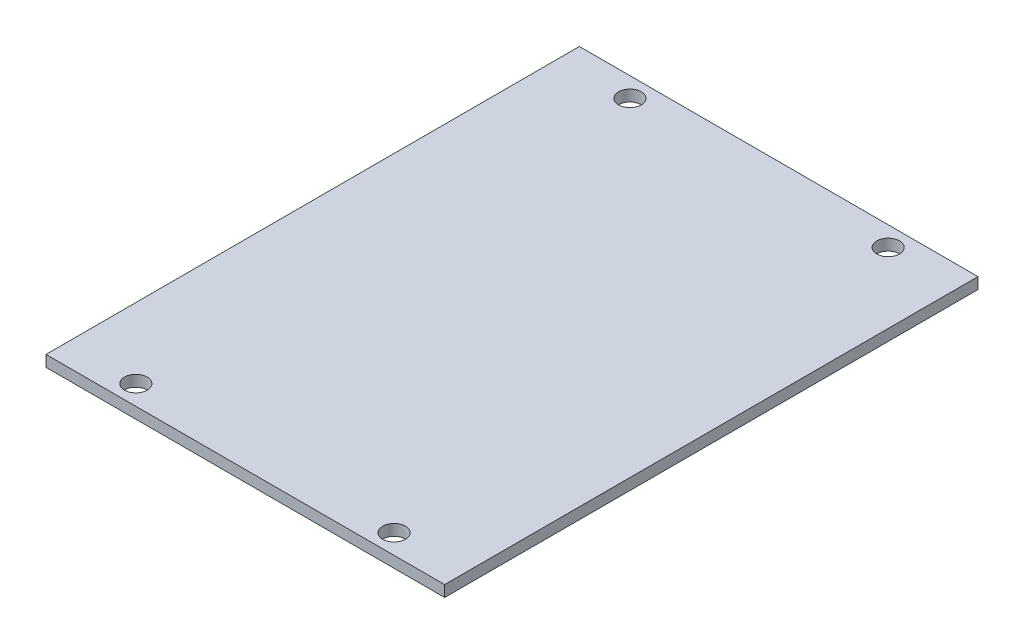
ISO-10303-21;
HEADER;
FILE_DESCRIPTION(('STEP AP214'),'2;1');
FILE_NAME('part.step','',(''),(''),'','','');
FILE_SCHEMA(('AUTOMOTIVE_DESIGN { 1 0 10303 214 1 1 1 1 }'));
ENDSEC;
DATA;
#1=APPLICATION_CONTEXT('core data for automotive mechanical design processes');
#2=APPLICATION_PROTOCOL_DEFINITION('international standard','automotive_design',2000,#1);
#3=PRODUCT_CONTEXT('',#1,'mechanical');
#4=PRODUCT('Part','Part','',(#3));
#5=PRODUCT_RELATED_PRODUCT_CATEGORY('part','',(#4));
#6=PRODUCT_DEFINITION_FORMATION('','',#4);
#7=PRODUCT_DEFINITION_CONTEXT('part definition',#1,'design');
#8=PRODUCT_DEFINITION('design','',#6,#7);
#9=PRODUCT_DEFINITION_SHAPE('','',#8);
#10=(LENGTH_UNIT() NAMED_UNIT(*) SI_UNIT(.MILLI.,.METRE.));
#11=(NAMED_UNIT(*) PLANE_ANGLE_UNIT() SI_UNIT($,.RADIAN.));
#12=(NAMED_UNIT(*) SI_UNIT($,.STERADIAN.) SOLID_ANGLE_UNIT());
#13=UNCERTAINTY_MEASURE_WITH_UNIT(LENGTH_MEASURE(1.E-05),#10,'distance_accuracy_value','');
#14=(GEOMETRIC_REPRESENTATION_CONTEXT(3) GLOBAL_UNCERTAINTY_ASSIGNED_CONTEXT((#13)) GLOBAL_UNIT_ASSIGNED_CONTEXT((#10,
#11,#12)) REPRESENTATION_CONTEXT('',''));
#15=CARTESIAN_POINT('',(0.,0.,0.));
#16=DIRECTION('',(0.,0.,1.));
#17=DIRECTION('',(1.,0.,0.));
#18=AXIS2_PLACEMENT_3D('',#15,#16,#17);
#19=CARTESIAN_POINT('',(35.5,2.,47.5));
#20=DIRECTION('',(-1.,0.,0.));
#21=DIRECTION('',(0.,0.,1.));
#22=AXIS2_PLACEMENT_3D('',#19,#20,#21);
#23=PLANE('',#22);
#24=DIRECTION('',(0.,0.,-1.));
#25=VECTOR('',#24,1.);
#26=CARTESIAN_POINT('',(35.5,0.,47.5));
#27=LINE('',#26,#25);
#28=CARTESIAN_POINT('',(35.5,0.,47.5));
#29=VERTEX_POINT('',#28);
#30=CARTESIAN_POINT('',(35.5,0.,-47.5));
#31=VERTEX_POINT('',#30);
#32=EDGE_CURVE('E104',#29,#31,#27,.T.);
#33=ORIENTED_EDGE('',*,*,#32,.T.);
#34=DIRECTION('',(0.,-1.,0.));
#35=VECTOR('',#34,1.);
#36=CARTESIAN_POINT('',(35.5,2.,-47.5));
#37=LINE('',#36,#35);
#38=CARTESIAN_POINT('',(35.5,2.,-47.5));
#39=VERTEX_POINT('',#38);
#40=EDGE_CURVE('E11',#39,#31,#37,.T.);
#41=ORIENTED_EDGE('',*,*,#40,.F.);
#42=DIRECTION('',(0.,0.,-1.));
#43=VECTOR('',#42,1.);
#44=CARTESIAN_POINT('',(35.5,2.,47.5));
#45=LINE('',#44,#43);
#46=CARTESIAN_POINT('',(35.5,2.,47.5));
#47=VERTEX_POINT('',#46);
#48=EDGE_CURVE('E92',#47,#39,#45,.T.);
#49=ORIENTED_EDGE('',*,*,#48,.F.);
#50=DIRECTION('',(0.,-1.,0.));
#51=VECTOR('',#50,1.);
#52=CARTESIAN_POINT('',(35.5,2.,47.5));
#53=LINE('',#52,#51);
#54=EDGE_CURVE('E100',#47,#29,#53,.T.);
#55=ORIENTED_EDGE('',*,*,#54,.T.);
#56=EDGE_LOOP('',(#33,#41,#49,#55));
#57=FACE_BOUND('',#56,.T.);
#58=ADVANCED_FACE('F41',(#57),#23,.F.);
#59=CARTESIAN_POINT('',(-35.5,2.,-47.5));
#60=DIRECTION('',(0.,0.,1.));
#61=DIRECTION('',(1.,0.,0.));
#62=AXIS2_PLACEMENT_3D('',#59,#60,#61);
#63=PLANE('',#62);
#64=DIRECTION('',(-1.,0.,0.));
#65=VECTOR('',#64,1.);
#66=CARTESIAN_POINT('',(-35.5,0.,-47.5));
#67=LINE('',#66,#65);
#68=CARTESIAN_POINT('',(-35.5,0.,-47.5));
#69=VERTEX_POINT('',#68);
#70=EDGE_CURVE('E96',#31,#69,#67,.T.);
#71=ORIENTED_EDGE('',*,*,#70,.T.);
#72=DIRECTION('',(0.,-1.,0.));
#73=VECTOR('',#72,1.);
#74=CARTESIAN_POINT('',(-35.5,2.,-47.5));
#75=LINE('',#74,#73);
#76=CARTESIAN_POINT('',(-35.5,2.,-47.5));
#77=VERTEX_POINT('',#76);
#78=EDGE_CURVE('E49',#77,#69,#75,.T.);
#79=ORIENTED_EDGE('',*,*,#78,.F.);
#80=DIRECTION('',(-1.,0.,0.));
#81=VECTOR('',#80,1.);
#82=CARTESIAN_POINT('',(-35.5,2.,-47.5));
#83=LINE('',#82,#81);
#84=EDGE_CURVE('E87',#39,#77,#83,.T.);
#85=ORIENTED_EDGE('',*,*,#84,.F.);
#86=ORIENTED_EDGE('',*,*,#40,.T.);
#87=EDGE_LOOP('',(#71,#79,#85,#86));
#88=FACE_BOUND('',#87,.T.);
#89=ADVANCED_FACE('F95',(#88),#63,.F.);
#90=CARTESIAN_POINT('',(-35.5,2.,47.5));
#91=DIRECTION('',(1.,0.,0.));
#92=DIRECTION('',(0.,0.,-1.));
#93=AXIS2_PLACEMENT_3D('',#90,#91,#92);
#94=PLANE('',#93);
#95=DIRECTION('',(0.,0.,1.));
#96=VECTOR('',#95,1.);
#97=CARTESIAN_POINT('',(-35.5,0.,47.5));
#98=LINE('',#97,#96);
#99=CARTESIAN_POINT('',(-35.5,0.,47.5));
#100=VERTEX_POINT('',#99);
#101=EDGE_CURVE('E74',#69,#100,#98,.T.);
#102=ORIENTED_EDGE('',*,*,#101,.T.);
#103=DIRECTION('',(0.,-1.,0.));
#104=VECTOR('',#103,1.);
#105=CARTESIAN_POINT('',(-35.5,2.,47.5));
#106=LINE('',#105,#104);
#107=CARTESIAN_POINT('',(-35.5,2.,47.5));
#108=VERTEX_POINT('',#107);
#109=EDGE_CURVE('E97',#108,#100,#106,.T.);
#110=ORIENTED_EDGE('',*,*,#109,.F.);
#111=DIRECTION('',(0.,0.,1.));
#112=VECTOR('',#111,1.);
#113=CARTESIAN_POINT('',(-35.5,2.,47.5));
#114=LINE('',#113,#112);
#115=EDGE_CURVE('E90',#77,#108,#114,.T.);
#116=ORIENTED_EDGE('',*,*,#115,.F.);
#117=ORIENTED_EDGE('',*,*,#78,.T.);
#118=EDGE_LOOP('',(#102,#110,#116,#117));
#119=FACE_BOUND('',#118,.T.);
#120=ADVANCED_FACE('F98',(#119),#94,.F.);
#121=CARTESIAN_POINT('',(-35.5,2.,47.5));
#122=DIRECTION('',(0.,0.,-1.));
#123=DIRECTION('',(-1.,0.,0.));
#124=AXIS2_PLACEMENT_3D('',#121,#122,#123);
#125=PLANE('',#124);
#126=DIRECTION('',(1.,0.,0.));
#127=VECTOR('',#126,1.);
#128=CARTESIAN_POINT('',(-35.5,0.,47.5));
#129=LINE('',#128,#127);
#130=EDGE_CURVE('E80',#100,#29,#129,.T.);
#131=ORIENTED_EDGE('',*,*,#130,.T.);
#132=ORIENTED_EDGE('',*,*,#54,.F.);
#133=DIRECTION('',(1.,0.,0.));
#134=VECTOR('',#133,1.);
#135=CARTESIAN_POINT('',(-35.5,2.,47.5));
#136=LINE('',#135,#134);
#137=EDGE_CURVE('E57',#108,#47,#136,.T.);
#138=ORIENTED_EDGE('',*,*,#137,.F.);
#139=ORIENTED_EDGE('',*,*,#109,.T.);
#140=EDGE_LOOP('',(#131,#132,#138,#139));
#141=FACE_BOUND('',#140,.T.);
#142=ADVANCED_FACE('F112',(#141),#125,.F.);
#143=CARTESIAN_POINT('',(0.,2.,0.));
#144=DIRECTION('',(0.,-1.,0.));
#145=DIRECTION('',(0.,0.,-1.));
#146=AXIS2_PLACEMENT_3D('',#143,#144,#145);
#147=PLANE('',#146);
#148=CARTESIAN_POINT('',(23.,2.,-44.));
#149=DIRECTION('',(0.,1.,0.));
#150=DIRECTION('',(0.,0.,-1.));
#151=AXIS2_PLACEMENT_3D('',#148,#149,#150);
#152=CIRCLE('',#151,2.025);
#153=CARTESIAN_POINT('',(23.,2.,-46.025));
#154=VERTEX_POINT('',#153);
#155=EDGE_CURVE('E121',#154,#154,#152,.T.);
#156=ORIENTED_EDGE('',*,*,#155,.F.);
#157=EDGE_LOOP('',(#156));
#158=FACE_BOUND('',#157,.T.);
#159=CARTESIAN_POINT('',(-23.,2.,44.));
#160=DIRECTION('',(0.,1.,0.));
#161=DIRECTION('',(0.,0.,-1.));
#162=AXIS2_PLACEMENT_3D('',#159,#160,#161);
#163=CIRCLE('',#162,2.025);
#164=CARTESIAN_POINT('',(-23.,2.,41.975));
#165=VERTEX_POINT('',#164);
#166=EDGE_CURVE('E127',#165,#165,#163,.T.);
#167=ORIENTED_EDGE('',*,*,#166,.F.);
#168=EDGE_LOOP('',(#167));
#169=FACE_BOUND('',#168,.T.);
#170=CARTESIAN_POINT('',(23.,2.,44.));
#171=DIRECTION('',(0.,1.,0.));
#172=DIRECTION('',(0.,0.,1.));
#173=AXIS2_PLACEMENT_3D('',#170,#171,#172);
#174=CIRCLE('',#173,2.025);
#175=CARTESIAN_POINT('',(23.,2.,46.025));
#176=VERTEX_POINT('',#175);
#177=EDGE_CURVE('E128',#176,#176,#174,.T.);
#178=ORIENTED_EDGE('',*,*,#177,.F.);
#179=EDGE_LOOP('',(#178));
#180=FACE_BOUND('',#179,.T.);
#181=CARTESIAN_POINT('',(-23.,2.,-44.));
#182=DIRECTION('',(0.,1.,0.));
#183=DIRECTION('',(0.,0.,1.));
#184=AXIS2_PLACEMENT_3D('',#181,#182,#183);
#185=CIRCLE('',#184,2.025);
#186=CARTESIAN_POINT('',(-23.,2.,-41.975));
#187=VERTEX_POINT('',#186);
#188=EDGE_CURVE('E118',#187,#187,#185,.T.);
#189=ORIENTED_EDGE('',*,*,#188,.F.);
#190=EDGE_LOOP('',(#189));
#191=FACE_BOUND('',#190,.T.);
#192=ORIENTED_EDGE('',*,*,#48,.T.);
#193=ORIENTED_EDGE('',*,*,#84,.T.);
#194=ORIENTED_EDGE('',*,*,#115,.T.);
#195=ORIENTED_EDGE('',*,*,#137,.T.);
#196=EDGE_LOOP('',(#192,#193,#194,#195));
#197=FACE_BOUND('',#196,.T.);
#198=ADVANCED_FACE('F88',(#158,#169,#180,#191,#197),#147,.F.);
#199=CARTESIAN_POINT('',(0.,0.,0.));
#200=DIRECTION('',(0.,-1.,0.));
#201=DIRECTION('',(0.,0.,-1.));
#202=AXIS2_PLACEMENT_3D('',#199,#200,#201);
#203=PLANE('',#202);
#204=CARTESIAN_POINT('',(23.,0.,-44.));
#205=DIRECTION('',(0.,1.,0.));
#206=DIRECTION('',(0.,0.,-1.));
#207=AXIS2_PLACEMENT_3D('',#204,#205,#206);
#208=CIRCLE('',#207,2.025);
#209=CARTESIAN_POINT('',(23.,0.,-46.025));
#210=VERTEX_POINT('',#209);
#211=EDGE_CURVE('E131',#210,#210,#208,.T.);
#212=ORIENTED_EDGE('',*,*,#211,.T.);
#213=EDGE_LOOP('',(#212));
#214=FACE_BOUND('',#213,.T.);
#215=CARTESIAN_POINT('',(-23.,0.,44.));
#216=DIRECTION('',(0.,1.,0.));
#217=DIRECTION('',(0.,0.,-1.));
#218=AXIS2_PLACEMENT_3D('',#215,#216,#217);
#219=CIRCLE('',#218,2.025);
#220=CARTESIAN_POINT('',(-23.,0.,41.975));
#221=VERTEX_POINT('',#220);
#222=EDGE_CURVE('E124',#221,#221,#219,.T.);
#223=ORIENTED_EDGE('',*,*,#222,.T.);
#224=EDGE_LOOP('',(#223));
#225=FACE_BOUND('',#224,.T.);
#226=CARTESIAN_POINT('',(23.,0.,44.));
#227=DIRECTION('',(0.,1.,0.));
#228=DIRECTION('',(0.,0.,1.));
#229=AXIS2_PLACEMENT_3D('',#226,#227,#228);
#230=CIRCLE('',#229,2.025);
#231=CARTESIAN_POINT('',(23.,0.,46.025));
#232=VERTEX_POINT('',#231);
#233=EDGE_CURVE('E136',#232,#232,#230,.T.);
#234=ORIENTED_EDGE('',*,*,#233,.T.);
#235=EDGE_LOOP('',(#234));
#236=FACE_BOUND('',#235,.T.);
#237=CARTESIAN_POINT('',(-23.,0.,-44.));
#238=DIRECTION('',(0.,1.,0.));
#239=DIRECTION('',(0.,0.,1.));
#240=AXIS2_PLACEMENT_3D('',#237,#238,#239);
#241=CIRCLE('',#240,2.025);
#242=CARTESIAN_POINT('',(-23.,0.,-41.975));
#243=VERTEX_POINT('',#242);
#244=EDGE_CURVE('E107',#243,#243,#241,.T.);
#245=ORIENTED_EDGE('',*,*,#244,.T.);
#246=EDGE_LOOP('',(#245));
#247=FACE_BOUND('',#246,.T.);
#248=ORIENTED_EDGE('',*,*,#32,.F.);
#249=ORIENTED_EDGE('',*,*,#130,.F.);
#250=ORIENTED_EDGE('',*,*,#101,.F.);
#251=ORIENTED_EDGE('',*,*,#70,.F.);
#252=EDGE_LOOP('',(#248,#249,#250,#251));
#253=FACE_BOUND('',#252,.T.);
#254=ADVANCED_FACE('F115',(#214,#225,#236,#247,#253),#203,.T.);
#255=CARTESIAN_POINT('',(-23.,0.,-44.));
#256=DIRECTION('',(0.,1.,0.));
#257=DIRECTION('',(0.,0.,1.));
#258=AXIS2_PLACEMENT_3D('',#255,#256,#257);
#259=CYLINDRICAL_SURFACE('',#258,2.025);
#260=ORIENTED_EDGE('',*,*,#244,.F.);
#261=EDGE_LOOP('',(#260));
#262=FACE_BOUND('',#261,.T.);
#263=ORIENTED_EDGE('',*,*,#188,.T.);
#264=EDGE_LOOP('',(#263));
#265=FACE_BOUND('',#264,.T.);
#266=ADVANCED_FACE('F150',(#262,#265),#259,.F.);
#267=CARTESIAN_POINT('',(23.,0.,44.));
#268=DIRECTION('',(0.,1.,0.));
#269=DIRECTION('',(0.,0.,1.));
#270=AXIS2_PLACEMENT_3D('',#267,#268,#269);
#271=CYLINDRICAL_SURFACE('',#270,2.025);
#272=ORIENTED_EDGE('',*,*,#233,.F.);
#273=EDGE_LOOP('',(#272));
#274=FACE_BOUND('',#273,.T.);
#275=ORIENTED_EDGE('',*,*,#177,.T.);
#276=EDGE_LOOP('',(#275));
#277=FACE_BOUND('',#276,.T.);
#278=ADVANCED_FACE('F142',(#274,#277),#271,.F.);
#279=CARTESIAN_POINT('',(-23.,0.,44.));
#280=DIRECTION('',(0.,1.,0.));
#281=DIRECTION('',(0.,0.,1.));
#282=AXIS2_PLACEMENT_3D('',#279,#280,#281);
#283=CYLINDRICAL_SURFACE('',#282,2.025);
#284=ORIENTED_EDGE('',*,*,#222,.F.);
#285=EDGE_LOOP('',(#284));
#286=FACE_BOUND('',#285,.T.);
#287=ORIENTED_EDGE('',*,*,#166,.T.);
#288=EDGE_LOOP('',(#287));
#289=FACE_BOUND('',#288,.T.);
#290=ADVANCED_FACE('F158',(#286,#289),#283,.F.);
#291=CARTESIAN_POINT('',(23.,0.,-44.));
#292=DIRECTION('',(0.,1.,0.));
#293=DIRECTION('',(0.,0.,1.));
#294=AXIS2_PLACEMENT_3D('',#291,#292,#293);
#295=CYLINDRICAL_SURFACE('',#294,2.025);
#296=ORIENTED_EDGE('',*,*,#211,.F.);
#297=EDGE_LOOP('',(#296));
#298=FACE_BOUND('',#297,.T.);
#299=ORIENTED_EDGE('',*,*,#155,.T.);
#300=EDGE_LOOP('',(#299));
#301=FACE_BOUND('',#300,.T.);
#302=ADVANCED_FACE('F209',(#298,#301),#295,.F.);
#303=CLOSED_SHELL('',(#58,#89,#120,#142,#198,#254,#266,#278,#290,#302));
#304=MANIFOLD_SOLID_BREP('B2',#303);
#305=ADVANCED_BREP_SHAPE_REPRESENTATION('',(#18,#304),#14);
#306=SHAPE_DEFINITION_REPRESENTATION(#9,#305);
ENDSEC;
END-ISO-10303-21;
